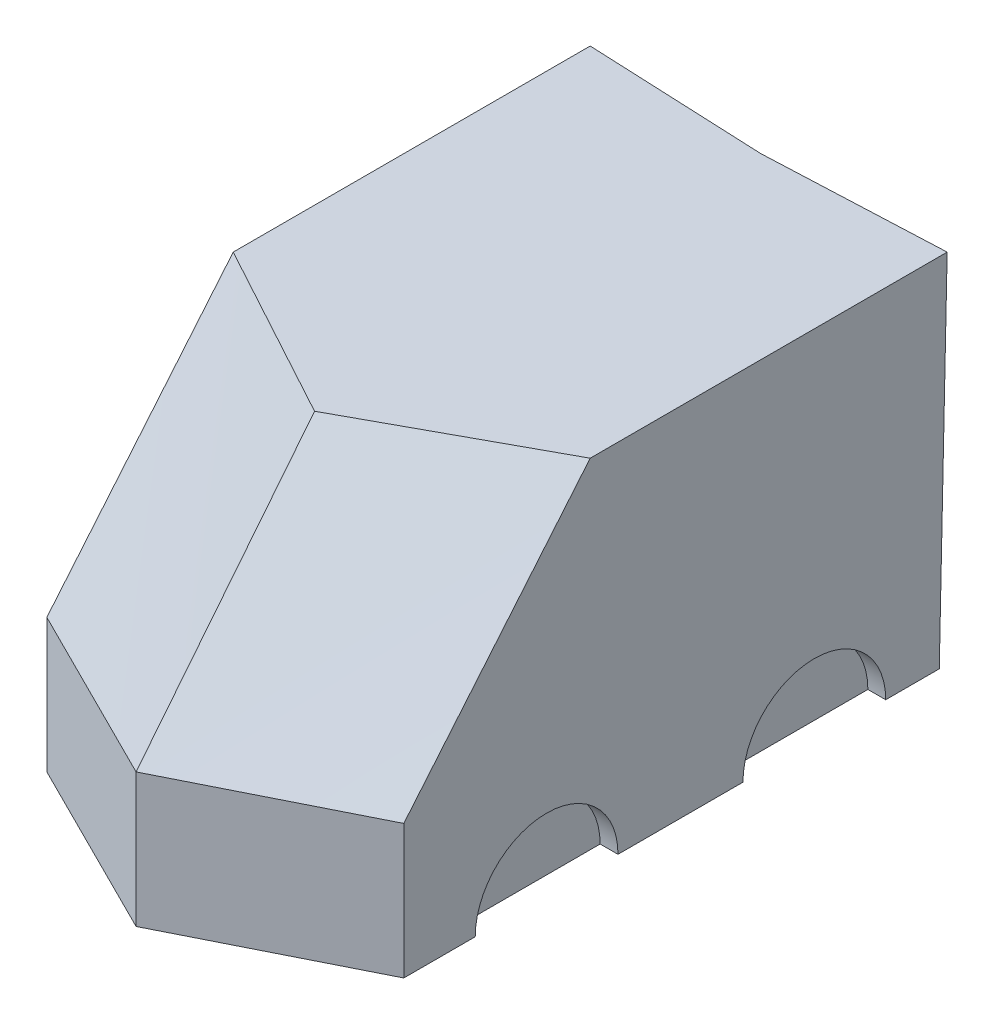
ISO-10303-21;
HEADER;
FILE_DESCRIPTION(('STEP AP214'),'2;1');
FILE_NAME('part.step','',(''),(''),'','','');
FILE_SCHEMA(('AUTOMOTIVE_DESIGN { 1 0 10303 214 1 1 1 1 }'));
ENDSEC;
DATA;
#1=APPLICATION_CONTEXT('core data for automotive mechanical design processes');
#2=APPLICATION_PROTOCOL_DEFINITION('international standard','automotive_design',2000,#1);
#3=PRODUCT_CONTEXT('',#1,'mechanical');
#4=PRODUCT('Part','Part','',(#3));
#5=PRODUCT_RELATED_PRODUCT_CATEGORY('part','',(#4));
#6=PRODUCT_DEFINITION_FORMATION('','',#4);
#7=PRODUCT_DEFINITION_CONTEXT('part definition',#1,'design');
#8=PRODUCT_DEFINITION('design','',#6,#7);
#9=PRODUCT_DEFINITION_SHAPE('','',#8);
#10=(LENGTH_UNIT() NAMED_UNIT(*) SI_UNIT(.MILLI.,.METRE.));
#11=(NAMED_UNIT(*) PLANE_ANGLE_UNIT() SI_UNIT($,.RADIAN.));
#12=(NAMED_UNIT(*) SI_UNIT($,.STERADIAN.) SOLID_ANGLE_UNIT());
#13=UNCERTAINTY_MEASURE_WITH_UNIT(LENGTH_MEASURE(1.E-05),#10,'distance_accuracy_value','');
#14=(GEOMETRIC_REPRESENTATION_CONTEXT(3) GLOBAL_UNCERTAINTY_ASSIGNED_CONTEXT((#13)) GLOBAL_UNIT_ASSIGNED_CONTEXT((#10,
#11,#12)) REPRESENTATION_CONTEXT('',''));
#15=CARTESIAN_POINT('',(0.,0.,0.));
#16=DIRECTION('',(0.,0.,1.));
#17=DIRECTION('',(1.,0.,0.));
#18=AXIS2_PLACEMENT_3D('',#15,#16,#17);
#19=CARTESIAN_POINT('',(0.,0.,0.));
#20=DIRECTION('',(0.,1.,0.));
#21=DIRECTION('',(0.,0.,1.));
#22=AXIS2_PLACEMENT_3D('',#19,#20,#21);
#23=PLANE('',#22);
#24=DIRECTION('',(-1.,0.,0.));
#25=VECTOR('',#24,1.);
#26=CARTESIAN_POINT('',(-90.,0.,30.));
#27=LINE('',#26,#25);
#28=CARTESIAN_POINT('',(-100.,0.,30.));
#29=VERTEX_POINT('',#28);
#30=CARTESIAN_POINT('',(-90.,0.,30.));
#31=VERTEX_POINT('',#30);
#32=EDGE_CURVE('E168',#29,#31,#27,.F.);
#33=ORIENTED_EDGE('',*,*,#32,.F.);
#34=DIRECTION('',(0.,0.,-1.));
#35=VECTOR('',#34,1.);
#36=CARTESIAN_POINT('',(-100.,0.,300.));
#37=LINE('',#36,#35);
#38=CARTESIAN_POINT('',(-100.,0.,0.));
#39=VERTEX_POINT('',#38);
#40=EDGE_CURVE('E60',#29,#39,#37,.T.);
#41=ORIENTED_EDGE('',*,*,#40,.T.);
#42=DIRECTION('',(-1.,0.,0.));
#43=VECTOR('',#42,1.);
#44=CARTESIAN_POINT('',(0.,0.,0.));
#45=LINE('',#44,#43);
#46=CARTESIAN_POINT('',(0.,0.,0.));
#47=VERTEX_POINT('',#46);
#48=EDGE_CURVE('E210',#47,#39,#45,.T.);
#49=ORIENTED_EDGE('',*,*,#48,.F.);
#50=DIRECTION('',(1.,0.,0.));
#51=VECTOR('',#50,1.);
#52=CARTESIAN_POINT('',(0.,0.,0.));
#53=LINE('',#52,#51);
#54=CARTESIAN_POINT('',(100.,0.,0.));
#55=VERTEX_POINT('',#54);
#56=EDGE_CURVE('E435',#47,#55,#53,.T.);
#57=ORIENTED_EDGE('',*,*,#56,.T.);
#58=DIRECTION('',(0.,0.,-1.));
#59=VECTOR('',#58,1.);
#60=CARTESIAN_POINT('',(100.,0.,300.));
#61=LINE('',#60,#59);
#62=CARTESIAN_POINT('',(100.,0.,30.));
#63=VERTEX_POINT('',#62);
#64=EDGE_CURVE('E531',#63,#55,#61,.T.);
#65=ORIENTED_EDGE('',*,*,#64,.F.);
#66=DIRECTION('',(1.,0.,0.));
#67=VECTOR('',#66,1.);
#68=CARTESIAN_POINT('',(90.,0.,30.));
#69=LINE('',#68,#67);
#70=CARTESIAN_POINT('',(90.,0.,30.));
#71=VERTEX_POINT('',#70);
#72=EDGE_CURVE('E794',#63,#71,#69,.F.);
#73=ORIENTED_EDGE('',*,*,#72,.T.);
#74=DIRECTION('',(0.,0.,-1.));
#75=VECTOR('',#74,1.);
#76=CARTESIAN_POINT('',(90.,0.,0.));
#77=LINE('',#76,#75);
#78=CARTESIAN_POINT('',(90.,0.,110.));
#79=VERTEX_POINT('',#78);
#80=EDGE_CURVE('E513',#79,#71,#77,.T.);
#81=ORIENTED_EDGE('',*,*,#80,.F.);
#82=DIRECTION('',(1.,0.,0.));
#83=VECTOR('',#82,1.);
#84=CARTESIAN_POINT('',(90.,0.,110.));
#85=LINE('',#84,#83);
#86=CARTESIAN_POINT('',(100.,0.,110.));
#87=VERTEX_POINT('',#86);
#88=EDGE_CURVE('E604',#79,#87,#85,.T.);
#89=ORIENTED_EDGE('',*,*,#88,.T.);
#90=CARTESIAN_POINT('',(100.,0.,180.));
#91=VERTEX_POINT('',#90);
#92=EDGE_CURVE('E501',#91,#87,#61,.T.);
#93=ORIENTED_EDGE('',*,*,#92,.F.);
#94=DIRECTION('',(1.,0.,0.));
#95=VECTOR('',#94,1.);
#96=CARTESIAN_POINT('',(90.,0.,180.));
#97=LINE('',#96,#95);
#98=CARTESIAN_POINT('',(90.,0.,180.));
#99=VERTEX_POINT('',#98);
#100=EDGE_CURVE('E505',#91,#99,#97,.F.);
#101=ORIENTED_EDGE('',*,*,#100,.T.);
#102=DIRECTION('',(0.,0.,-1.));
#103=VECTOR('',#102,1.);
#104=CARTESIAN_POINT('',(90.,0.,0.));
#105=LINE('',#104,#103);
#106=CARTESIAN_POINT('',(90.,0.,260.));
#107=VERTEX_POINT('',#106);
#108=EDGE_CURVE('E503',#107,#99,#105,.T.);
#109=ORIENTED_EDGE('',*,*,#108,.F.);
#110=DIRECTION('',(1.,0.,0.));
#111=VECTOR('',#110,1.);
#112=CARTESIAN_POINT('',(90.,0.,260.));
#113=LINE('',#112,#111);
#114=CARTESIAN_POINT('',(100.,0.,260.));
#115=VERTEX_POINT('',#114);
#116=EDGE_CURVE('E508',#107,#115,#113,.T.);
#117=ORIENTED_EDGE('',*,*,#116,.T.);
#118=CARTESIAN_POINT('',(100.,0.,300.));
#119=VERTEX_POINT('',#118);
#120=EDGE_CURVE('E516',#119,#115,#61,.T.);
#121=ORIENTED_EDGE('',*,*,#120,.F.);
#122=DIRECTION('',(0.894427190999916,0.,-0.447213595499958));
#123=VECTOR('',#122,1.);
#124=CARTESIAN_POINT('',(0.,0.,350.));
#125=LINE('',#124,#123);
#126=CARTESIAN_POINT('',(0.,0.,350.));
#127=VERTEX_POINT('',#126);
#128=EDGE_CURVE('E414',#127,#119,#125,.T.);
#129=ORIENTED_EDGE('',*,*,#128,.F.);
#130=DIRECTION('',(-0.894427190999916,0.,-0.447213595499958));
#131=VECTOR('',#130,1.);
#132=CARTESIAN_POINT('',(0.,0.,350.));
#133=LINE('',#132,#131);
#134=CARTESIAN_POINT('',(-100.,0.,300.));
#135=VERTEX_POINT('',#134);
#136=EDGE_CURVE('E619',#127,#135,#133,.T.);
#137=ORIENTED_EDGE('',*,*,#136,.T.);
#138=CARTESIAN_POINT('',(-100.,0.,260.));
#139=VERTEX_POINT('',#138);
#140=EDGE_CURVE('E327',#135,#139,#37,.T.);
#141=ORIENTED_EDGE('',*,*,#140,.T.);
#142=DIRECTION('',(-1.,0.,0.));
#143=VECTOR('',#142,1.);
#144=CARTESIAN_POINT('',(-90.,0.,260.));
#145=LINE('',#144,#143);
#146=CARTESIAN_POINT('',(-90.,0.,260.));
#147=VERTEX_POINT('',#146);
#148=EDGE_CURVE('E82',#147,#139,#145,.T.);
#149=ORIENTED_EDGE('',*,*,#148,.F.);
#150=DIRECTION('',(0.,0.,1.));
#151=VECTOR('',#150,1.);
#152=CARTESIAN_POINT('',(-90.,0.,0.));
#153=LINE('',#152,#151);
#154=CARTESIAN_POINT('',(-90.,0.,180.));
#155=VERTEX_POINT('',#154);
#156=EDGE_CURVE('E66',#155,#147,#153,.T.);
#157=ORIENTED_EDGE('',*,*,#156,.F.);
#158=DIRECTION('',(-1.,0.,0.));
#159=VECTOR('',#158,1.);
#160=CARTESIAN_POINT('',(-90.,0.,180.));
#161=LINE('',#160,#159);
#162=CARTESIAN_POINT('',(-100.,0.,180.));
#163=VERTEX_POINT('',#162);
#164=EDGE_CURVE('E201',#163,#155,#161,.F.);
#165=ORIENTED_EDGE('',*,*,#164,.F.);
#166=CARTESIAN_POINT('',(-100.,0.,110.));
#167=VERTEX_POINT('',#166);
#168=EDGE_CURVE('E184',#163,#167,#37,.T.);
#169=ORIENTED_EDGE('',*,*,#168,.T.);
#170=DIRECTION('',(-1.,0.,0.));
#171=VECTOR('',#170,1.);
#172=CARTESIAN_POINT('',(-90.,0.,110.));
#173=LINE('',#172,#171);
#174=CARTESIAN_POINT('',(-90.,0.,110.));
#175=VERTEX_POINT('',#174);
#176=EDGE_CURVE('E74',#175,#167,#173,.T.);
#177=ORIENTED_EDGE('',*,*,#176,.F.);
#178=DIRECTION('',(0.,0.,1.));
#179=VECTOR('',#178,1.);
#180=CARTESIAN_POINT('',(-90.,0.,0.));
#181=LINE('',#180,#179);
#182=EDGE_CURVE('E12',#31,#175,#181,.T.);
#183=ORIENTED_EDGE('',*,*,#182,.F.);
#184=EDGE_LOOP('',(#33,#41,#49,#57,#65,#73,#81,#89,#93,#101,#109,#117,#121,#129,#137,#141,#149,
#157,#165,#169,#177,#183));
#185=FACE_BOUND('',#184,.T.);
#186=ADVANCED_FACE('F55',(#185),#23,.F.);
#187=CARTESIAN_POINT('',(100.,0.,0.));
#188=DIRECTION('',(-1.,0.,0.));
#189=DIRECTION('',(0.,0.,1.));
#190=AXIS2_PLACEMENT_3D('',#187,#188,#189);
#191=PLANE('',#190);
#192=ORIENTED_EDGE('',*,*,#92,.T.);
#193=CARTESIAN_POINT('',(100.,0.,70.));
#194=DIRECTION('',(1.,0.,0.));
#195=DIRECTION('',(0.,0.,-1.));
#196=AXIS2_PLACEMENT_3D('',#193,#194,#195);
#197=CIRCLE('',#196,40.);
#198=EDGE_CURVE('E271',#63,#87,#197,.T.);
#199=ORIENTED_EDGE('',*,*,#198,.F.);
#200=ORIENTED_EDGE('',*,*,#64,.T.);
#201=DIRECTION('',(0.,0.999755615365875,-0.0221067759838454));
#202=VECTOR('',#201,1.);
#203=CARTESIAN_POINT('',(100.,0.,0.));
#204=LINE('',#203,#202);
#205=CARTESIAN_POINT('',(100.,200.,-4.42243597216607));
#206=VERTEX_POINT('',#205);
#207=EDGE_CURVE('E481',#55,#206,#204,.T.);
#208=ORIENTED_EDGE('',*,*,#207,.T.);
#209=DIRECTION('',(0.,0.,1.));
#210=VECTOR('',#209,1.);
#211=CARTESIAN_POINT('',(100.,200.,-4.42243597216607));
#212=LINE('',#211,#210);
#213=CARTESIAN_POINT('',(100.,200.,195.577564027834));
#214=VERTEX_POINT('',#213);
#215=EDGE_CURVE('E545',#206,#214,#212,.T.);
#216=ORIENTED_EDGE('',*,*,#215,.T.);
#217=DIRECTION('',(0.,-0.767448433055201,0.641110678901168));
#218=VECTOR('',#217,1.);
#219=CARTESIAN_POINT('',(100.,200.,195.577564027834));
#220=LINE('',#219,#218);
#221=CARTESIAN_POINT('',(100.,75.,300.));
#222=VERTEX_POINT('',#221);
#223=EDGE_CURVE('E377',#214,#222,#220,.T.);
#224=ORIENTED_EDGE('',*,*,#223,.T.);
#225=DIRECTION('',(0.,-1.,0.));
#226=VECTOR('',#225,1.);
#227=CARTESIAN_POINT('',(100.,75.,300.));
#228=LINE('',#227,#226);
#229=EDGE_CURVE('E506',#222,#119,#228,.T.);
#230=ORIENTED_EDGE('',*,*,#229,.T.);
#231=ORIENTED_EDGE('',*,*,#120,.T.);
#232=CARTESIAN_POINT('',(100.,0.,220.));
#233=DIRECTION('',(1.,0.,0.));
#234=DIRECTION('',(0.,0.,-1.));
#235=AXIS2_PLACEMENT_3D('',#232,#233,#234);
#236=CIRCLE('',#235,40.);
#237=EDGE_CURVE('E574',#91,#115,#236,.T.);
#238=ORIENTED_EDGE('',*,*,#237,.F.);
#239=EDGE_LOOP('',(#192,#199,#200,#208,#216,#224,#230,#231,#238));
#240=FACE_BOUND('',#239,.T.);
#241=ADVANCED_FACE('F57',(#240),#191,.F.);
#242=CARTESIAN_POINT('',(0.,200.,250.));
#243=CARTESIAN_POINT('',(100.,200.,195.577564027834));
#244=CARTESIAN_POINT('',(0.,179.166666666666,266.666666666667));
#245=CARTESIAN_POINT('',(100.,179.166666666666,212.981303356529));
#246=CARTESIAN_POINT('',(0.,158.333333333333,283.333333333333));
#247=CARTESIAN_POINT('',(100.,158.333333333332,230.385042685223));
#248=CARTESIAN_POINT('',(0.,116.666666666666,316.666666666667));
#249=CARTESIAN_POINT('',(100.,116.666666666666,265.192521342612));
#250=CARTESIAN_POINT('',(0.,95.8333333333331,333.333333333333));
#251=CARTESIAN_POINT('',(100.,95.8333333333327,282.596260671306));
#252=CARTESIAN_POINT('',(0.,75.,350.));
#253=CARTESIAN_POINT('',(100.,75.,300.));
#254=B_SPLINE_SURFACE_WITH_KNOTS('',3,1,((#242,#243),(#244,#245),(#246,#247),(#248,#249),(#250,
#251),(#252,#253)),.UNSPECIFIED.,.F.,.F.,.F.,(4,2,4),(2,2),(0.,0.5,1.),(0.,1.),.UNSPECIFIED.);
#255=DIRECTION('',(0.,-0.78086880944303,0.624695047554424));
#256=VECTOR('',#255,1.);
#257=CARTESIAN_POINT('',(0.,75.,350.));
#258=LINE('',#257,#256);
#259=CARTESIAN_POINT('',(0.,200.,250.));
#260=VERTEX_POINT('',#259);
#261=CARTESIAN_POINT('',(0.,75.,350.));
#262=VERTEX_POINT('',#261);
#263=EDGE_CURVE('E221',#260,#262,#258,.T.);
#264=DIRECTION('',(0.894427190999916,0.,-0.447213595499958));
#265=VECTOR('',#264,1.);
#266=CARTESIAN_POINT('',(50.,75.,325.));
#267=LINE('',#266,#265);
#268=EDGE_CURVE('E407',#262,#222,#267,.T.);
#269=DIRECTION('',(-0.878349414703036,0.,0.478019147828655));
#270=VECTOR('',#269,1.);
#271=CARTESIAN_POINT('',(50.,200.,222.788782013917));
#272=LINE('',#271,#270);
#273=EDGE_CURVE('E415',#214,#260,#272,.T.);
#274=ORIENTED_EDGE('',*,*,#263,.T.);
#275=ORIENTED_EDGE('',*,*,#268,.T.);
#276=ORIENTED_EDGE('',*,*,#223,.F.);
#277=ORIENTED_EDGE('',*,*,#273,.T.);
#278=EDGE_LOOP('',(#274,#275,#276,#277));
#279=FACE_BOUND('',#278,.T.);
#280=ADVANCED_FACE('F382',(#279),#254,.T.);
#281=CARTESIAN_POINT('',(140.,0.,280.));
#282=DIRECTION('',(-0.447213595499958,0.,-0.894427190999916));
#283=DIRECTION('',(-0.894427190999916,0.,0.447213595499958));
#284=AXIS2_PLACEMENT_3D('',#281,#282,#283);
#285=PLANE('',#284);
#286=ORIENTED_EDGE('',*,*,#128,.T.);
#287=ORIENTED_EDGE('',*,*,#229,.F.);
#288=ORIENTED_EDGE('',*,*,#268,.F.);
#289=DIRECTION('',(0.,-1.,0.));
#290=VECTOR('',#289,1.);
#291=CARTESIAN_POINT('',(0.,0.,350.));
#292=LINE('',#291,#290);
#293=EDGE_CURVE('E424',#262,#127,#292,.T.);
#294=ORIENTED_EDGE('',*,*,#293,.T.);
#295=EDGE_LOOP('',(#286,#287,#288,#294));
#296=FACE_BOUND('',#295,.T.);
#297=ADVANCED_FACE('F358',(#296),#285,.F.);
#298=CARTESIAN_POINT('',(0.,200.,0.));
#299=DIRECTION('',(0.,-1.,0.));
#300=DIRECTION('',(1.,0.,0.));
#301=AXIS2_PLACEMENT_3D('',#298,#299,#300);
#302=PLANE('',#301);
#303=ORIENTED_EDGE('',*,*,#273,.F.);
#304=ORIENTED_EDGE('',*,*,#215,.F.);
#305=DIRECTION('',(0.999023535093537,0.,-0.0441811761863817));
#306=VECTOR('',#305,1.);
#307=CARTESIAN_POINT('',(50.,200.,-2.21121798608304));
#308=LINE('',#307,#306);
#309=CARTESIAN_POINT('',(0.,200.,0.));
#310=VERTEX_POINT('',#309);
#311=EDGE_CURVE('E440',#310,#206,#308,.T.);
#312=ORIENTED_EDGE('',*,*,#311,.F.);
#313=DIRECTION('',(-0.999023535093537,0.,-0.0441811761863817));
#314=VECTOR('',#313,1.);
#315=CARTESIAN_POINT('',(-50.,200.,-2.21121798608304));
#316=LINE('',#315,#314);
#317=CARTESIAN_POINT('',(-100.,200.,-4.42243597216607));
#318=VERTEX_POINT('',#317);
#319=EDGE_CURVE('E208',#310,#318,#316,.T.);
#320=ORIENTED_EDGE('',*,*,#319,.T.);
#321=DIRECTION('',(0.,0.,1.));
#322=VECTOR('',#321,1.);
#323=CARTESIAN_POINT('',(-100.,200.,-4.42243597216607));
#324=LINE('',#323,#322);
#325=CARTESIAN_POINT('',(-100.,200.,195.577564027834));
#326=VERTEX_POINT('',#325);
#327=EDGE_CURVE('E326',#318,#326,#324,.T.);
#328=ORIENTED_EDGE('',*,*,#327,.T.);
#329=DIRECTION('',(0.878349414703036,0.,0.478019147828655));
#330=VECTOR('',#329,1.);
#331=CARTESIAN_POINT('',(-50.,200.,222.788782013917));
#332=LINE('',#331,#330);
#333=EDGE_CURVE('E205',#326,#260,#332,.T.);
#334=ORIENTED_EDGE('',*,*,#333,.T.);
#335=EDGE_LOOP('',(#303,#304,#312,#320,#328,#334));
#336=FACE_BOUND('',#335,.T.);
#337=ADVANCED_FACE('F335',(#336),#302,.F.);
#338=CARTESIAN_POINT('',(0.,0.,0.));
#339=CARTESIAN_POINT('',(100.,0.,0.));
#340=CARTESIAN_POINT('',(0.,33.3333333333336,0.));
#341=CARTESIAN_POINT('',(100.,33.3333333333333,-0.737072662027678));
#342=CARTESIAN_POINT('',(0.,66.6666666666671,0.));
#343=CARTESIAN_POINT('',(100.,66.6666666666666,-1.47414532405536));
#344=CARTESIAN_POINT('',(0.,133.333333333334,0.));
#345=CARTESIAN_POINT('',(100.,133.333333333333,-2.94829064811071));
#346=CARTESIAN_POINT('',(0.,166.666666666667,0.));
#347=CARTESIAN_POINT('',(100.,166.666666666667,-3.68536331013839));
#348=CARTESIAN_POINT('',(0.,200.,0.));
#349=CARTESIAN_POINT('',(100.,200.,-4.42243597216607));
#350=B_SPLINE_SURFACE_WITH_KNOTS('',3,1,((#338,#339),(#340,#341),(#342,#343),(#344,#345),(#346,
#347),(#348,#349)),.UNSPECIFIED.,.F.,.F.,.F.,(4,2,4),(2,2),(0.,0.5,1.),(0.,1.),.UNSPECIFIED.);
#351=DIRECTION('',(0.,1.,0.));
#352=VECTOR('',#351,1.);
#353=CARTESIAN_POINT('',(0.,200.,0.));
#354=LINE('',#353,#352);
#355=EDGE_CURVE('E449',#47,#310,#354,.T.);
#356=ORIENTED_EDGE('',*,*,#355,.T.);
#357=ORIENTED_EDGE('',*,*,#311,.T.);
#358=ORIENTED_EDGE('',*,*,#207,.F.);
#359=ORIENTED_EDGE('',*,*,#56,.F.);
#360=EDGE_LOOP('',(#356,#357,#358,#359));
#361=FACE_BOUND('',#360,.T.);
#362=ADVANCED_FACE('F357',(#361),#350,.T.);
#363=CARTESIAN_POINT('',(90.,0.,220.));
#364=DIRECTION('',(1.,0.,0.));
#365=DIRECTION('',(0.,0.,-1.));
#366=AXIS2_PLACEMENT_3D('',#363,#364,#365);
#367=CYLINDRICAL_SURFACE('',#366,40.);
#368=CARTESIAN_POINT('',(90.,0.,220.));
#369=DIRECTION('',(1.,0.,0.));
#370=DIRECTION('',(0.,0.,-1.));
#371=AXIS2_PLACEMENT_3D('',#368,#369,#370);
#372=CIRCLE('',#371,40.);
#373=EDGE_CURVE('E535',#99,#107,#372,.T.);
#374=ORIENTED_EDGE('',*,*,#373,.F.);
#375=ORIENTED_EDGE('',*,*,#100,.F.);
#376=ORIENTED_EDGE('',*,*,#237,.T.);
#377=ORIENTED_EDGE('',*,*,#116,.F.);
#378=EDGE_LOOP('',(#374,#375,#376,#377));
#379=FACE_BOUND('',#378,.T.);
#380=ADVANCED_FACE('F393',(#379),#367,.F.);
#381=CARTESIAN_POINT('',(90.,0.,220.));
#382=DIRECTION('',(1.,0.,0.));
#383=DIRECTION('',(0.,0.,-1.));
#384=AXIS2_PLACEMENT_3D('',#381,#382,#383);
#385=PLANE('',#384);
#386=ORIENTED_EDGE('',*,*,#108,.T.);
#387=ORIENTED_EDGE('',*,*,#373,.T.);
#388=EDGE_LOOP('',(#386,#387));
#389=FACE_BOUND('',#388,.T.);
#390=ADVANCED_FACE('F691',(#389),#385,.T.);
#391=CARTESIAN_POINT('',(90.,0.,70.));
#392=DIRECTION('',(1.,0.,0.));
#393=DIRECTION('',(0.,0.,-1.));
#394=AXIS2_PLACEMENT_3D('',#391,#392,#393);
#395=CYLINDRICAL_SURFACE('',#394,40.);
#396=CARTESIAN_POINT('',(90.,0.,70.));
#397=DIRECTION('',(1.,0.,0.));
#398=DIRECTION('',(0.,0.,-1.));
#399=AXIS2_PLACEMENT_3D('',#396,#397,#398);
#400=CIRCLE('',#399,40.);
#401=EDGE_CURVE('E586',#71,#79,#400,.T.);
#402=ORIENTED_EDGE('',*,*,#401,.F.);
#403=ORIENTED_EDGE('',*,*,#72,.F.);
#404=ORIENTED_EDGE('',*,*,#198,.T.);
#405=ORIENTED_EDGE('',*,*,#88,.F.);
#406=EDGE_LOOP('',(#402,#403,#404,#405));
#407=FACE_BOUND('',#406,.T.);
#408=ADVANCED_FACE('F698',(#407),#395,.F.);
#409=CARTESIAN_POINT('',(90.,0.,70.));
#410=DIRECTION('',(1.,0.,0.));
#411=DIRECTION('',(0.,0.,-1.));
#412=AXIS2_PLACEMENT_3D('',#409,#410,#411);
#413=PLANE('',#412);
#414=ORIENTED_EDGE('',*,*,#80,.T.);
#415=ORIENTED_EDGE('',*,*,#401,.T.);
#416=EDGE_LOOP('',(#414,#415));
#417=FACE_BOUND('',#416,.T.);
#418=ADVANCED_FACE('F293',(#417),#413,.T.);
#419=CARTESIAN_POINT('',(-100.,0.,0.));
#420=DIRECTION('',(1.,0.,0.));
#421=DIRECTION('',(0.,0.,1.));
#422=AXIS2_PLACEMENT_3D('',#419,#420,#421);
#423=PLANE('',#422);
#424=CARTESIAN_POINT('',(-100.,0.,70.));
#425=DIRECTION('',(1.,0.,0.));
#426=DIRECTION('',(0.,0.,-1.));
#427=AXIS2_PLACEMENT_3D('',#424,#425,#426);
#428=CIRCLE('',#427,40.);
#429=EDGE_CURVE('E172',#29,#167,#428,.T.);
#430=ORIENTED_EDGE('',*,*,#429,.T.);
#431=ORIENTED_EDGE('',*,*,#168,.F.);
#432=CARTESIAN_POINT('',(-100.,0.,220.));
#433=DIRECTION('',(1.,0.,0.));
#434=DIRECTION('',(0.,0.,-1.));
#435=AXIS2_PLACEMENT_3D('',#432,#433,#434);
#436=CIRCLE('',#435,40.);
#437=EDGE_CURVE('E176',#163,#139,#436,.T.);
#438=ORIENTED_EDGE('',*,*,#437,.T.);
#439=ORIENTED_EDGE('',*,*,#140,.F.);
#440=DIRECTION('',(0.,-1.,0.));
#441=VECTOR('',#440,1.);
#442=CARTESIAN_POINT('',(-100.,75.,300.));
#443=LINE('',#442,#441);
#444=CARTESIAN_POINT('',(-100.,75.,300.));
#445=VERTEX_POINT('',#444);
#446=EDGE_CURVE('E268',#445,#135,#443,.T.);
#447=ORIENTED_EDGE('',*,*,#446,.F.);
#448=DIRECTION('',(0.,-0.767448433055201,0.641110678901168));
#449=VECTOR('',#448,1.);
#450=CARTESIAN_POINT('',(-100.,200.,195.577564027834));
#451=LINE('',#450,#449);
#452=EDGE_CURVE('E272',#326,#445,#451,.T.);
#453=ORIENTED_EDGE('',*,*,#452,.F.);
#454=ORIENTED_EDGE('',*,*,#327,.F.);
#455=DIRECTION('',(0.,0.999755615365875,-0.0221067759838454));
#456=VECTOR('',#455,1.);
#457=CARTESIAN_POINT('',(-100.,0.,0.));
#458=LINE('',#457,#456);
#459=EDGE_CURVE('E318',#39,#318,#458,.T.);
#460=ORIENTED_EDGE('',*,*,#459,.F.);
#461=ORIENTED_EDGE('',*,*,#40,.F.);
#462=EDGE_LOOP('',(#430,#431,#438,#439,#447,#453,#454,#460,#461));
#463=FACE_BOUND('',#462,.T.);
#464=ADVANCED_FACE('F240',(#463),#423,.F.);
#465=CARTESIAN_POINT('',(0.,200.,250.));
#466=CARTESIAN_POINT('',(-100.,200.,195.577564027834));
#467=CARTESIAN_POINT('',(0.,179.166666666666,266.666666666667));
#468=CARTESIAN_POINT('',(-100.,179.166666666666,212.981303356529));
#469=CARTESIAN_POINT('',(0.,158.333333333333,283.333333333333));
#470=CARTESIAN_POINT('',(-100.,158.333333333332,230.385042685223));
#471=CARTESIAN_POINT('',(0.,116.666666666666,316.666666666667));
#472=CARTESIAN_POINT('',(-100.,116.666666666666,265.192521342612));
#473=CARTESIAN_POINT('',(0.,95.8333333333331,333.333333333333));
#474=CARTESIAN_POINT('',(-100.,95.8333333333327,282.596260671306));
#475=CARTESIAN_POINT('',(0.,75.,350.));
#476=CARTESIAN_POINT('',(-100.,75.,300.));
#477=B_SPLINE_SURFACE_WITH_KNOTS('',3,1,((#465,#466),(#467,#468),(#469,#470),(#471,#472),(#473,
#474),(#475,#476)),.UNSPECIFIED.,.F.,.F.,.F.,(4,2,4),(2,2),(0.,0.5,1.),(0.,1.),.UNSPECIFIED.);
#478=DIRECTION('',(-0.894427190999916,0.,-0.447213595499958));
#479=VECTOR('',#478,1.);
#480=CARTESIAN_POINT('',(-50.,75.,325.));
#481=LINE('',#480,#479);
#482=EDGE_CURVE('E215',#262,#445,#481,.T.);
#483=ORIENTED_EDGE('',*,*,#263,.F.);
#484=ORIENTED_EDGE('',*,*,#333,.F.);
#485=ORIENTED_EDGE('',*,*,#452,.T.);
#486=ORIENTED_EDGE('',*,*,#482,.F.);
#487=EDGE_LOOP('',(#483,#484,#485,#486));
#488=FACE_BOUND('',#487,.T.);
#489=ADVANCED_FACE('F227',(#488),#477,.F.);
#490=CARTESIAN_POINT('',(-140.,0.,280.));
#491=DIRECTION('',(0.447213595499958,0.,-0.894427190999916));
#492=DIRECTION('',(0.894427190999916,0.,0.447213595499958));
#493=AXIS2_PLACEMENT_3D('',#490,#491,#492);
#494=PLANE('',#493);
#495=ORIENTED_EDGE('',*,*,#136,.F.);
#496=ORIENTED_EDGE('',*,*,#293,.F.);
#497=ORIENTED_EDGE('',*,*,#482,.T.);
#498=ORIENTED_EDGE('',*,*,#446,.T.);
#499=EDGE_LOOP('',(#495,#496,#497,#498));
#500=FACE_BOUND('',#499,.T.);
#501=ADVANCED_FACE('F239',(#500),#494,.F.);
#502=CARTESIAN_POINT('',(0.,0.,0.));
#503=CARTESIAN_POINT('',(-100.,0.,0.));
#504=CARTESIAN_POINT('',(0.,33.3333333333336,0.));
#505=CARTESIAN_POINT('',(-100.,33.3333333333333,-0.737072662027678));
#506=CARTESIAN_POINT('',(0.,66.6666666666671,0.));
#507=CARTESIAN_POINT('',(-100.,66.6666666666666,-1.47414532405536));
#508=CARTESIAN_POINT('',(0.,133.333333333334,0.));
#509=CARTESIAN_POINT('',(-100.,133.333333333333,-2.94829064811071));
#510=CARTESIAN_POINT('',(0.,166.666666666667,0.));
#511=CARTESIAN_POINT('',(-100.,166.666666666667,-3.68536331013839));
#512=CARTESIAN_POINT('',(0.,200.,0.));
#513=CARTESIAN_POINT('',(-100.,200.,-4.42243597216607));
#514=B_SPLINE_SURFACE_WITH_KNOTS('',3,1,((#502,#503),(#504,#505),(#506,#507),(#508,#509),(#510,
#511),(#512,#513)),.UNSPECIFIED.,.F.,.F.,.F.,(4,2,4),(2,2),(0.,0.5,1.),(0.,1.),.UNSPECIFIED.);
#515=ORIENTED_EDGE('',*,*,#355,.F.);
#516=ORIENTED_EDGE('',*,*,#48,.T.);
#517=ORIENTED_EDGE('',*,*,#459,.T.);
#518=ORIENTED_EDGE('',*,*,#319,.F.);
#519=EDGE_LOOP('',(#515,#516,#517,#518));
#520=FACE_BOUND('',#519,.T.);
#521=ADVANCED_FACE('F294',(#520),#514,.F.);
#522=CARTESIAN_POINT('',(-90.,0.,220.));
#523=DIRECTION('',(-1.,0.,0.));
#524=DIRECTION('',(0.,0.,-1.));
#525=AXIS2_PLACEMENT_3D('',#522,#523,#524);
#526=PLANE('',#525);
#527=ORIENTED_EDGE('',*,*,#156,.T.);
#528=CARTESIAN_POINT('',(-90.,0.,220.));
#529=DIRECTION('',(1.,0.,0.));
#530=DIRECTION('',(0.,0.,-1.));
#531=AXIS2_PLACEMENT_3D('',#528,#529,#530);
#532=CIRCLE('',#531,40.);
#533=EDGE_CURVE('E195',#155,#147,#532,.T.);
#534=ORIENTED_EDGE('',*,*,#533,.F.);
#535=EDGE_LOOP('',(#527,#534));
#536=FACE_BOUND('',#535,.T.);
#537=ADVANCED_FACE('F654',(#536),#526,.T.);
#538=CARTESIAN_POINT('',(-90.,0.,220.));
#539=DIRECTION('',(-1.,0.,0.));
#540=DIRECTION('',(0.,0.,1.));
#541=AXIS2_PLACEMENT_3D('',#538,#539,#540);
#542=CYLINDRICAL_SURFACE('',#541,40.);
#543=ORIENTED_EDGE('',*,*,#164,.T.);
#544=ORIENTED_EDGE('',*,*,#533,.T.);
#545=ORIENTED_EDGE('',*,*,#148,.T.);
#546=ORIENTED_EDGE('',*,*,#437,.F.);
#547=EDGE_LOOP('',(#543,#544,#545,#546));
#548=FACE_BOUND('',#547,.T.);
#549=ADVANCED_FACE('F241',(#548),#542,.F.);
#550=CARTESIAN_POINT('',(-90.,0.,70.));
#551=DIRECTION('',(-1.,0.,0.));
#552=DIRECTION('',(0.,0.,-1.));
#553=AXIS2_PLACEMENT_3D('',#550,#551,#552);
#554=PLANE('',#553);
#555=ORIENTED_EDGE('',*,*,#182,.T.);
#556=CARTESIAN_POINT('',(-90.,0.,70.));
#557=DIRECTION('',(1.,0.,0.));
#558=DIRECTION('',(0.,0.,-1.));
#559=AXIS2_PLACEMENT_3D('',#556,#557,#558);
#560=CIRCLE('',#559,40.);
#561=EDGE_CURVE('E171',#31,#175,#560,.T.);
#562=ORIENTED_EDGE('',*,*,#561,.F.);
#563=EDGE_LOOP('',(#555,#562));
#564=FACE_BOUND('',#563,.T.);
#565=ADVANCED_FACE('F179',(#564),#554,.T.);
#566=CARTESIAN_POINT('',(-90.,0.,70.));
#567=DIRECTION('',(-1.,0.,0.));
#568=DIRECTION('',(0.,0.,1.));
#569=AXIS2_PLACEMENT_3D('',#566,#567,#568);
#570=CYLINDRICAL_SURFACE('',#569,40.);
#571=ORIENTED_EDGE('',*,*,#32,.T.);
#572=ORIENTED_EDGE('',*,*,#561,.T.);
#573=ORIENTED_EDGE('',*,*,#176,.T.);
#574=ORIENTED_EDGE('',*,*,#429,.F.);
#575=EDGE_LOOP('',(#571,#572,#573,#574));
#576=FACE_BOUND('',#575,.T.);
#577=ADVANCED_FACE('F170',(#576),#570,.F.);
#578=CLOSED_SHELL('',(#186,#241,#280,#297,#337,#362,#380,#390,#408,#418,#464,#489,#501,#521,
#537,#549,#565,#577));
#579=MANIFOLD_SOLID_BREP('B2',#578);
#580=ADVANCED_BREP_SHAPE_REPRESENTATION('',(#18,#579),#14);
#581=SHAPE_DEFINITION_REPRESENTATION(#9,#580);
ENDSEC;
END-ISO-10303-21;
